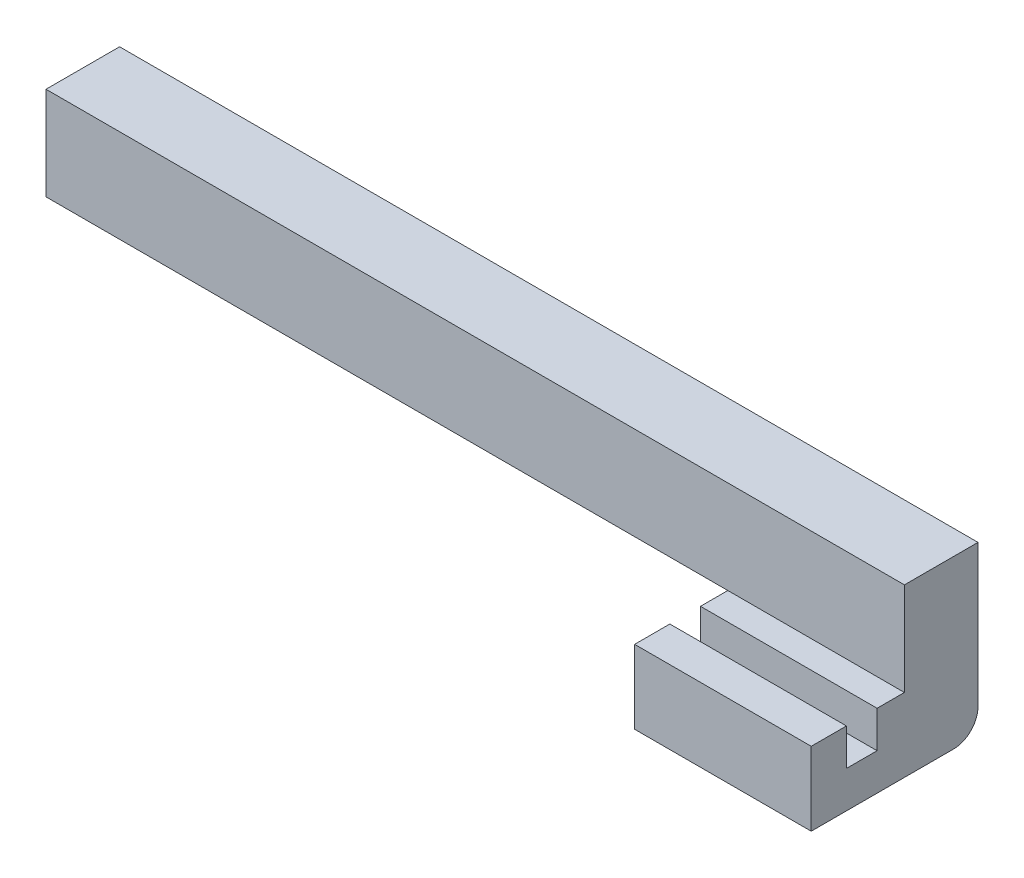
ISO-10303-21;
HEADER;
FILE_DESCRIPTION(('STEP AP214'),'2;1');
FILE_NAME('part.step','',(''),(''),'','','');
FILE_SCHEMA(('AUTOMOTIVE_DESIGN { 1 0 10303 214 1 1 1 1 }'));
ENDSEC;
DATA;
#1=APPLICATION_CONTEXT('core data for automotive mechanical design processes');
#2=APPLICATION_PROTOCOL_DEFINITION('international standard','automotive_design',2000,#1);
#3=PRODUCT_CONTEXT('',#1,'mechanical');
#4=PRODUCT('Part','Part','',(#3));
#5=PRODUCT_RELATED_PRODUCT_CATEGORY('part','',(#4));
#6=PRODUCT_DEFINITION_FORMATION('','',#4);
#7=PRODUCT_DEFINITION_CONTEXT('part definition',#1,'design');
#8=PRODUCT_DEFINITION('design','',#6,#7);
#9=PRODUCT_DEFINITION_SHAPE('','',#8);
#10=(LENGTH_UNIT() NAMED_UNIT(*) SI_UNIT(.MILLI.,.METRE.));
#11=(NAMED_UNIT(*) PLANE_ANGLE_UNIT() SI_UNIT($,.RADIAN.));
#12=(NAMED_UNIT(*) SI_UNIT($,.STERADIAN.) SOLID_ANGLE_UNIT());
#13=UNCERTAINTY_MEASURE_WITH_UNIT(LENGTH_MEASURE(1.E-05),#10,'distance_accuracy_value','');
#14=(GEOMETRIC_REPRESENTATION_CONTEXT(3) GLOBAL_UNCERTAINTY_ASSIGNED_CONTEXT((#13)) GLOBAL_UNIT_ASSIGNED_CONTEXT((#10,
#11,#12)) REPRESENTATION_CONTEXT('',''));
#15=CARTESIAN_POINT('',(0.,0.,0.));
#16=DIRECTION('',(0.,0.,1.));
#17=DIRECTION('',(1.,0.,0.));
#18=AXIS2_PLACEMENT_3D('',#15,#16,#17);
#19=CARTESIAN_POINT('',(0.,3.,0.));
#20=DIRECTION('',(0.,1.,0.));
#21=DIRECTION('',(0.,0.,1.));
#22=AXIS2_PLACEMENT_3D('',#19,#20,#21);
#23=PLANE('',#22);
#24=DIRECTION('',(-1.,0.,0.));
#25=VECTOR('',#24,1.);
#26=CARTESIAN_POINT('',(-1.6,3.,-0.785554579913609));
#27=LINE('',#26,#25);
#28=CARTESIAN_POINT('',(3.6,3.,-0.785554579913609));
#29=VERTEX_POINT('',#28);
#30=CARTESIAN_POINT('',(-3.6,3.,-0.785554579913609));
#31=VERTEX_POINT('',#30);
#32=EDGE_CURVE('E260',#29,#31,#27,.T.);
#33=ORIENTED_EDGE('',*,*,#32,.F.);
#34=DIRECTION('',(0.,0.,-1.));
#35=VECTOR('',#34,1.);
#36=CARTESIAN_POINT('',(3.6,3.,-1.9));
#37=LINE('',#36,#35);
#38=CARTESIAN_POINT('',(3.6,3.,-1.9));
#39=VERTEX_POINT('',#38);
#40=EDGE_CURVE('E299',#29,#39,#37,.T.);
#41=ORIENTED_EDGE('',*,*,#40,.T.);
#42=DIRECTION('',(-1.,0.,0.));
#43=VECTOR('',#42,1.);
#44=CARTESIAN_POINT('',(-3.6,3.,-1.9));
#45=LINE('',#44,#43);
#46=CARTESIAN_POINT('',(-3.6,3.,-1.9));
#47=VERTEX_POINT('',#46);
#48=EDGE_CURVE('E298',#39,#47,#45,.T.);
#49=ORIENTED_EDGE('',*,*,#48,.T.);
#50=DIRECTION('',(0.,0.,1.));
#51=VECTOR('',#50,1.);
#52=CARTESIAN_POINT('',(-3.6,3.,-1.9));
#53=LINE('',#52,#51);
#54=EDGE_CURVE('E178',#47,#31,#53,.T.);
#55=ORIENTED_EDGE('',*,*,#54,.T.);
#56=EDGE_LOOP('',(#33,#41,#49,#55));
#57=FACE_BOUND('',#56,.T.);
#58=ADVANCED_FACE('F45',(#57),#23,.T.);
#59=CARTESIAN_POINT('',(1.6,3.,-0.785554579913609));
#60=DIRECTION('',(-1.,0.,0.));
#61=DIRECTION('',(0.,0.,1.));
#62=AXIS2_PLACEMENT_3D('',#59,#60,#61);
#63=PLANE('',#62);
#64=DIRECTION('',(0.,-1.,0.));
#65=VECTOR('',#64,1.);
#66=CARTESIAN_POINT('',(1.6,3.,0.464445420086391));
#67=LINE('',#66,#65);
#68=CARTESIAN_POINT('',(1.6,1.5,0.464445420086391));
#69=VERTEX_POINT('',#68);
#70=CARTESIAN_POINT('',(1.6,0.,0.464445420086391));
#71=VERTEX_POINT('',#70);
#72=EDGE_CURVE('E267',#69,#71,#67,.T.);
#73=ORIENTED_EDGE('',*,*,#72,.F.);
#74=DIRECTION('',(0.,0.,-1.));
#75=VECTOR('',#74,1.);
#76=CARTESIAN_POINT('',(1.6,1.5,-0.785554579913609));
#77=LINE('',#76,#75);
#78=CARTESIAN_POINT('',(1.6,1.5,-0.785554579913609));
#79=VERTEX_POINT('',#78);
#80=EDGE_CURVE('E234',#69,#79,#77,.T.);
#81=ORIENTED_EDGE('',*,*,#80,.T.);
#82=DIRECTION('',(0.,-1.,0.));
#83=VECTOR('',#82,1.);
#84=CARTESIAN_POINT('',(1.6,3.,-0.785554579913609));
#85=LINE('',#84,#83);
#86=CARTESIAN_POINT('',(1.6,0.,-0.785554579913609));
#87=VERTEX_POINT('',#86);
#88=EDGE_CURVE('E290',#79,#87,#85,.T.);
#89=ORIENTED_EDGE('',*,*,#88,.T.);
#90=DIRECTION('',(0.,0.,-1.));
#91=VECTOR('',#90,1.);
#92=CARTESIAN_POINT('',(1.6,0.,-0.785554579913609));
#93=LINE('',#92,#91);
#94=EDGE_CURVE('E259',#71,#87,#93,.T.);
#95=ORIENTED_EDGE('',*,*,#94,.F.);
#96=EDGE_LOOP('',(#73,#81,#89,#95));
#97=FACE_BOUND('',#96,.T.);
#98=ADVANCED_FACE('F390',(#97),#63,.T.);
#99=CARTESIAN_POINT('',(-1.6,3.,-0.785554579913609));
#100=DIRECTION('',(1.,0.,0.));
#101=DIRECTION('',(0.,0.,-1.));
#102=AXIS2_PLACEMENT_3D('',#99,#100,#101);
#103=PLANE('',#102);
#104=DIRECTION('',(0.,-1.,0.));
#105=VECTOR('',#104,1.);
#106=CARTESIAN_POINT('',(-1.6,3.,-0.785554579913609));
#107=LINE('',#106,#105);
#108=CARTESIAN_POINT('',(-1.6,1.5,-0.785554579913609));
#109=VERTEX_POINT('',#108);
#110=CARTESIAN_POINT('',(-1.6,0.,-0.785554579913609));
#111=VERTEX_POINT('',#110);
#112=EDGE_CURVE('E287',#109,#111,#107,.T.);
#113=ORIENTED_EDGE('',*,*,#112,.F.);
#114=DIRECTION('',(0.,0.,1.));
#115=VECTOR('',#114,1.);
#116=CARTESIAN_POINT('',(-1.6,1.5,-0.785554579913609));
#117=LINE('',#116,#115);
#118=CARTESIAN_POINT('',(-1.6,1.5,0.464445420086391));
#119=VERTEX_POINT('',#118);
#120=EDGE_CURVE('E230',#109,#119,#117,.T.);
#121=ORIENTED_EDGE('',*,*,#120,.T.);
#122=DIRECTION('',(0.,-1.,0.));
#123=VECTOR('',#122,1.);
#124=CARTESIAN_POINT('',(-1.6,3.,0.464445420086391));
#125=LINE('',#124,#123);
#126=CARTESIAN_POINT('',(-1.6,0.,0.464445420086391));
#127=VERTEX_POINT('',#126);
#128=EDGE_CURVE('E284',#119,#127,#125,.T.);
#129=ORIENTED_EDGE('',*,*,#128,.T.);
#130=DIRECTION('',(0.,0.,1.));
#131=VECTOR('',#130,1.);
#132=CARTESIAN_POINT('',(-1.6,0.,-0.785554579913609));
#133=LINE('',#132,#131);
#134=EDGE_CURVE('E275',#111,#127,#133,.T.);
#135=ORIENTED_EDGE('',*,*,#134,.F.);
#136=EDGE_LOOP('',(#113,#121,#129,#135));
#137=FACE_BOUND('',#136,.T.);
#138=ADVANCED_FACE('F343',(#137),#103,.T.);
#139=DIRECTION('',(1.,0.,0.));
#140=VECTOR('',#139,1.);
#141=CARTESIAN_POINT('',(-1.6,3.,0.464445420086391));
#142=LINE('',#141,#140);
#143=CARTESIAN_POINT('',(-3.6,3.,0.464445420086391));
#144=VERTEX_POINT('',#143);
#145=CARTESIAN_POINT('',(3.6,3.,0.464445420086391));
#146=VERTEX_POINT('',#145);
#147=EDGE_CURVE('E263',#144,#146,#142,.T.);
#148=ORIENTED_EDGE('',*,*,#147,.F.);
#149=CARTESIAN_POINT('',(-3.6,3.,1.9));
#150=VERTEX_POINT('',#149);
#151=EDGE_CURVE('E302',#144,#150,#53,.T.);
#152=ORIENTED_EDGE('',*,*,#151,.T.);
#153=DIRECTION('',(1.,0.,0.));
#154=VECTOR('',#153,1.);
#155=CARTESIAN_POINT('',(-3.6,3.,1.9));
#156=LINE('',#155,#154);
#157=CARTESIAN_POINT('',(3.6,3.,1.9));
#158=VERTEX_POINT('',#157);
#159=EDGE_CURVE('E305',#150,#158,#156,.T.);
#160=ORIENTED_EDGE('',*,*,#159,.T.);
#161=EDGE_CURVE('E294',#158,#146,#37,.T.);
#162=ORIENTED_EDGE('',*,*,#161,.T.);
#163=EDGE_LOOP('',(#148,#152,#160,#162));
#164=FACE_BOUND('',#163,.T.);
#165=ADVANCED_FACE('F364',(#164),#23,.T.);
#166=CARTESIAN_POINT('',(0.,0.,0.));
#167=DIRECTION('',(0.,1.,0.));
#168=DIRECTION('',(0.,0.,1.));
#169=AXIS2_PLACEMENT_3D('',#166,#167,#168);
#170=PLANE('',#169);
#171=DIRECTION('',(0.,0.,1.));
#172=VECTOR('',#171,1.);
#173=CARTESIAN_POINT('',(-3.6,0.,-1.9));
#174=LINE('',#173,#172);
#175=CARTESIAN_POINT('',(-3.6,0.,-3.9));
#176=VERTEX_POINT('',#175);
#177=CARTESIAN_POINT('',(-3.6,0.,1.9));
#178=VERTEX_POINT('',#177);
#179=EDGE_CURVE('E311',#176,#178,#174,.T.);
#180=ORIENTED_EDGE('',*,*,#179,.F.);
#181=DIRECTION('',(-1.,0.,0.));
#182=VECTOR('',#181,1.);
#183=CARTESIAN_POINT('',(0.,0.,-3.9));
#184=LINE('',#183,#182);
#185=CARTESIAN_POINT('',(3.6,0.,-3.9));
#186=VERTEX_POINT('',#185);
#187=EDGE_CURVE('E54',#176,#186,#184,.F.);
#188=ORIENTED_EDGE('',*,*,#187,.T.);
#189=DIRECTION('',(0.,0.,-1.));
#190=VECTOR('',#189,1.);
#191=CARTESIAN_POINT('',(3.6,0.,-1.9));
#192=LINE('',#191,#190);
#193=CARTESIAN_POINT('',(3.6,0.,1.9));
#194=VERTEX_POINT('',#193);
#195=EDGE_CURVE('E293',#194,#186,#192,.T.);
#196=ORIENTED_EDGE('',*,*,#195,.F.);
#197=DIRECTION('',(1.,0.,0.));
#198=VECTOR('',#197,1.);
#199=CARTESIAN_POINT('',(-3.6,0.,1.9));
#200=LINE('',#199,#198);
#201=EDGE_CURVE('E314',#178,#194,#200,.T.);
#202=ORIENTED_EDGE('',*,*,#201,.F.);
#203=EDGE_LOOP('',(#180,#188,#196,#202));
#204=FACE_BOUND('',#203,.T.);
#205=ORIENTED_EDGE('',*,*,#94,.T.);
#206=DIRECTION('',(-1.,0.,0.));
#207=VECTOR('',#206,1.);
#208=CARTESIAN_POINT('',(-1.6,0.,-0.785554579913609));
#209=LINE('',#208,#207);
#210=EDGE_CURVE('E271',#87,#111,#209,.T.);
#211=ORIENTED_EDGE('',*,*,#210,.T.);
#212=ORIENTED_EDGE('',*,*,#134,.T.);
#213=DIRECTION('',(1.,0.,0.));
#214=VECTOR('',#213,1.);
#215=CARTESIAN_POINT('',(-1.6,0.,0.464445420086391));
#216=LINE('',#215,#214);
#217=EDGE_CURVE('E264',#127,#71,#216,.T.);
#218=ORIENTED_EDGE('',*,*,#217,.T.);
#219=EDGE_LOOP('',(#205,#211,#212,#218));
#220=FACE_BOUND('',#219,.T.);
#221=ADVANCED_FACE('F351',(#204,#220),#170,.F.);
#222=CARTESIAN_POINT('',(3.6,3.,-1.9));
#223=DIRECTION('',(-1.,0.,0.));
#224=DIRECTION('',(0.,0.,1.));
#225=AXIS2_PLACEMENT_3D('',#222,#223,#224);
#226=PLANE('',#225);
#227=ORIENTED_EDGE('',*,*,#195,.T.);
#228=CARTESIAN_POINT('',(3.6,1.,-3.9));
#229=DIRECTION('',(-1.,0.,0.));
#230=DIRECTION('',(0.,0.,1.));
#231=AXIS2_PLACEMENT_3D('',#228,#229,#230);
#232=CIRCLE('',#231,1.);
#233=CARTESIAN_POINT('',(3.6,1.,-4.9));
#234=VERTEX_POINT('',#233);
#235=EDGE_CURVE('E11',#186,#234,#232,.F.);
#236=ORIENTED_EDGE('',*,*,#235,.T.);
#237=DIRECTION('',(0.,-1.,0.));
#238=VECTOR('',#237,1.);
#239=CARTESIAN_POINT('',(3.6,0.,-4.9));
#240=LINE('',#239,#238);
#241=CARTESIAN_POINT('',(3.6,6.8,-4.9));
#242=VERTEX_POINT('',#241);
#243=EDGE_CURVE('E170',#242,#234,#240,.T.);
#244=ORIENTED_EDGE('',*,*,#243,.F.);
#245=DIRECTION('',(0.,0.,1.));
#246=VECTOR('',#245,1.);
#247=CARTESIAN_POINT('',(3.6,6.8,-4.9));
#248=LINE('',#247,#246);
#249=CARTESIAN_POINT('',(3.6,6.8,-1.9));
#250=VERTEX_POINT('',#249);
#251=EDGE_CURVE('E198',#242,#250,#248,.T.);
#252=ORIENTED_EDGE('',*,*,#251,.T.);
#253=DIRECTION('',(0.,-1.,0.));
#254=VECTOR('',#253,1.);
#255=CARTESIAN_POINT('',(3.6,0.,-1.9));
#256=LINE('',#255,#254);
#257=EDGE_CURVE('E199',#250,#39,#256,.T.);
#258=ORIENTED_EDGE('',*,*,#257,.T.);
#259=ORIENTED_EDGE('',*,*,#40,.F.);
#260=DIRECTION('',(0.,-1.,0.));
#261=VECTOR('',#260,1.);
#262=CARTESIAN_POINT('',(3.6,3.,-0.785554579913609));
#263=LINE('',#262,#261);
#264=CARTESIAN_POINT('',(3.6,1.5,-0.785554579913609));
#265=VERTEX_POINT('',#264);
#266=EDGE_CURVE('E255',#29,#265,#263,.T.);
#267=ORIENTED_EDGE('',*,*,#266,.T.);
#268=DIRECTION('',(0.,0.,-1.));
#269=VECTOR('',#268,1.);
#270=CARTESIAN_POINT('',(3.6,1.5,-1.9));
#271=LINE('',#270,#269);
#272=CARTESIAN_POINT('',(3.6,1.5,0.464445420086391));
#273=VERTEX_POINT('',#272);
#274=EDGE_CURVE('E241',#273,#265,#271,.T.);
#275=ORIENTED_EDGE('',*,*,#274,.F.);
#276=DIRECTION('',(0.,1.,0.));
#277=VECTOR('',#276,1.);
#278=CARTESIAN_POINT('',(3.6,3.,0.464445420086391));
#279=LINE('',#278,#277);
#280=EDGE_CURVE('E248',#273,#146,#279,.T.);
#281=ORIENTED_EDGE('',*,*,#280,.T.);
#282=ORIENTED_EDGE('',*,*,#161,.F.);
#283=DIRECTION('',(0.,-1.,0.));
#284=VECTOR('',#283,1.);
#285=CARTESIAN_POINT('',(3.6,3.,1.9));
#286=LINE('',#285,#284);
#287=EDGE_CURVE('E308',#158,#194,#286,.T.);
#288=ORIENTED_EDGE('',*,*,#287,.T.);
#289=EDGE_LOOP('',(#227,#236,#244,#252,#258,#259,#267,#275,#281,#282,#288));
#290=FACE_BOUND('',#289,.T.);
#291=ADVANCED_FACE('F363',(#290),#226,.F.);
#292=CARTESIAN_POINT('',(-3.6,3.,-1.9));
#293=DIRECTION('',(1.,0.,0.));
#294=DIRECTION('',(0.,0.,-1.));
#295=AXIS2_PLACEMENT_3D('',#292,#293,#294);
#296=PLANE('',#295);
#297=DIRECTION('',(0.,1.,0.));
#298=VECTOR('',#297,1.);
#299=CARTESIAN_POINT('',(-3.6,3.,-4.9));
#300=LINE('',#299,#298);
#301=CARTESIAN_POINT('',(-3.6,1.,-4.9));
#302=VERTEX_POINT('',#301);
#303=CARTESIAN_POINT('',(-3.6,3.,-4.9));
#304=VERTEX_POINT('',#303);
#305=EDGE_CURVE('E160',#302,#304,#300,.T.);
#306=ORIENTED_EDGE('',*,*,#305,.F.);
#307=CARTESIAN_POINT('',(-3.6,1.,-3.9));
#308=DIRECTION('',(1.,0.,0.));
#309=DIRECTION('',(0.,0.,-1.));
#310=AXIS2_PLACEMENT_3D('',#307,#308,#309);
#311=CIRCLE('',#310,1.);
#312=EDGE_CURVE('E68',#302,#176,#311,.F.);
#313=ORIENTED_EDGE('',*,*,#312,.T.);
#314=ORIENTED_EDGE('',*,*,#179,.T.);
#315=DIRECTION('',(0.,-1.,0.));
#316=VECTOR('',#315,1.);
#317=CARTESIAN_POINT('',(-3.6,3.,1.9));
#318=LINE('',#317,#316);
#319=EDGE_CURVE('E320',#150,#178,#318,.T.);
#320=ORIENTED_EDGE('',*,*,#319,.F.);
#321=ORIENTED_EDGE('',*,*,#151,.F.);
#322=DIRECTION('',(0.,-1.,0.));
#323=VECTOR('',#322,1.);
#324=CARTESIAN_POINT('',(-3.6,3.,0.464445420086391));
#325=LINE('',#324,#323);
#326=CARTESIAN_POINT('',(-3.6,1.5,0.464445420086391));
#327=VERTEX_POINT('',#326);
#328=EDGE_CURVE('E244',#144,#327,#325,.T.);
#329=ORIENTED_EDGE('',*,*,#328,.T.);
#330=DIRECTION('',(0.,0.,1.));
#331=VECTOR('',#330,1.);
#332=CARTESIAN_POINT('',(-3.6,1.5,-1.9));
#333=LINE('',#332,#331);
#334=CARTESIAN_POINT('',(-3.6,1.5,-0.785554579913609));
#335=VERTEX_POINT('',#334);
#336=EDGE_CURVE('E238',#335,#327,#333,.T.);
#337=ORIENTED_EDGE('',*,*,#336,.F.);
#338=DIRECTION('',(0.,1.,0.));
#339=VECTOR('',#338,1.);
#340=CARTESIAN_POINT('',(-3.6,3.,-0.785554579913609));
#341=LINE('',#340,#339);
#342=EDGE_CURVE('E252',#335,#31,#341,.T.);
#343=ORIENTED_EDGE('',*,*,#342,.T.);
#344=ORIENTED_EDGE('',*,*,#54,.F.);
#345=DIRECTION('',(0.,0.,1.));
#346=VECTOR('',#345,1.);
#347=CARTESIAN_POINT('',(-3.6,3.,-4.9));
#348=LINE('',#347,#346);
#349=EDGE_CURVE('E174',#304,#47,#348,.T.);
#350=ORIENTED_EDGE('',*,*,#349,.F.);
#351=EDGE_LOOP('',(#306,#313,#314,#320,#321,#329,#337,#343,#344,#350));
#352=FACE_BOUND('',#351,.T.);
#353=ADVANCED_FACE('F175',(#352),#296,.F.);
#354=CARTESIAN_POINT('',(-3.6,3.,1.9));
#355=DIRECTION('',(0.,0.,-1.));
#356=DIRECTION('',(-1.,0.,0.));
#357=AXIS2_PLACEMENT_3D('',#354,#355,#356);
#358=PLANE('',#357);
#359=ORIENTED_EDGE('',*,*,#201,.T.);
#360=ORIENTED_EDGE('',*,*,#287,.F.);
#361=ORIENTED_EDGE('',*,*,#159,.F.);
#362=ORIENTED_EDGE('',*,*,#319,.T.);
#363=EDGE_LOOP('',(#359,#360,#361,#362));
#364=FACE_BOUND('',#363,.T.);
#365=ADVANCED_FACE('F368',(#364),#358,.F.);
#366=CARTESIAN_POINT('',(-1.6,3.,-0.785554579913609));
#367=DIRECTION('',(0.,0.,1.));
#368=DIRECTION('',(1.,0.,0.));
#369=AXIS2_PLACEMENT_3D('',#366,#367,#368);
#370=PLANE('',#369);
#371=DIRECTION('',(-1.,0.,0.));
#372=VECTOR('',#371,1.);
#373=CARTESIAN_POINT('',(-5.5,1.5,-0.785554579913609));
#374=LINE('',#373,#372);
#375=EDGE_CURVE('E225',#109,#335,#374,.T.);
#376=ORIENTED_EDGE('',*,*,#375,.F.);
#377=ORIENTED_EDGE('',*,*,#112,.T.);
#378=ORIENTED_EDGE('',*,*,#210,.F.);
#379=ORIENTED_EDGE('',*,*,#88,.F.);
#380=EDGE_CURVE('E229',#265,#79,#374,.T.);
#381=ORIENTED_EDGE('',*,*,#380,.F.);
#382=ORIENTED_EDGE('',*,*,#266,.F.);
#383=ORIENTED_EDGE('',*,*,#32,.T.);
#384=ORIENTED_EDGE('',*,*,#342,.F.);
#385=EDGE_LOOP('',(#376,#377,#378,#379,#381,#382,#383,#384));
#386=FACE_BOUND('',#385,.T.);
#387=ADVANCED_FACE('F355',(#386),#370,.T.);
#388=CARTESIAN_POINT('',(-1.6,3.,0.464445420086391));
#389=DIRECTION('',(0.,0.,-1.));
#390=DIRECTION('',(-1.,0.,0.));
#391=AXIS2_PLACEMENT_3D('',#388,#389,#390);
#392=PLANE('',#391);
#393=ORIENTED_EDGE('',*,*,#147,.T.);
#394=ORIENTED_EDGE('',*,*,#280,.F.);
#395=DIRECTION('',(1.,0.,0.));
#396=VECTOR('',#395,1.);
#397=CARTESIAN_POINT('',(-5.5,1.5,0.464445420086391));
#398=LINE('',#397,#396);
#399=EDGE_CURVE('E182',#69,#273,#398,.T.);
#400=ORIENTED_EDGE('',*,*,#399,.F.);
#401=ORIENTED_EDGE('',*,*,#72,.T.);
#402=ORIENTED_EDGE('',*,*,#217,.F.);
#403=ORIENTED_EDGE('',*,*,#128,.F.);
#404=EDGE_CURVE('E224',#327,#119,#398,.T.);
#405=ORIENTED_EDGE('',*,*,#404,.F.);
#406=ORIENTED_EDGE('',*,*,#328,.F.);
#407=EDGE_LOOP('',(#393,#394,#400,#401,#402,#403,#405,#406));
#408=FACE_BOUND('',#407,.T.);
#409=ADVANCED_FACE('F346',(#408),#392,.T.);
#410=CARTESIAN_POINT('',(0.,1.5,0.));
#411=DIRECTION('',(0.,1.,0.));
#412=DIRECTION('',(0.,0.,1.));
#413=AXIS2_PLACEMENT_3D('',#410,#411,#412);
#414=PLANE('',#413);
#415=ORIENTED_EDGE('',*,*,#336,.T.);
#416=ORIENTED_EDGE('',*,*,#404,.T.);
#417=ORIENTED_EDGE('',*,*,#120,.F.);
#418=ORIENTED_EDGE('',*,*,#375,.T.);
#419=EDGE_LOOP('',(#415,#416,#417,#418));
#420=FACE_BOUND('',#419,.T.);
#421=ADVANCED_FACE('F335',(#420),#414,.T.);
#422=ORIENTED_EDGE('',*,*,#274,.T.);
#423=ORIENTED_EDGE('',*,*,#380,.T.);
#424=ORIENTED_EDGE('',*,*,#80,.F.);
#425=ORIENTED_EDGE('',*,*,#399,.T.);
#426=EDGE_LOOP('',(#422,#423,#424,#425));
#427=FACE_BOUND('',#426,.T.);
#428=ADVANCED_FACE('F388',(#427),#414,.T.);
#429=CARTESIAN_POINT('',(0.,0.,-1.9));
#430=DIRECTION('',(0.,0.,1.));
#431=DIRECTION('',(1.,0.,0.));
#432=AXIS2_PLACEMENT_3D('',#429,#430,#431);
#433=PLANE('',#432);
#434=ORIENTED_EDGE('',*,*,#48,.F.);
#435=ORIENTED_EDGE('',*,*,#257,.F.);
#436=DIRECTION('',(1.,0.,0.));
#437=VECTOR('',#436,1.);
#438=CARTESIAN_POINT('',(3.6,6.8,-1.9));
#439=LINE('',#438,#437);
#440=CARTESIAN_POINT('',(-31.4,6.8,-1.9));
#441=VERTEX_POINT('',#440);
#442=EDGE_CURVE('E209',#441,#250,#439,.T.);
#443=ORIENTED_EDGE('',*,*,#442,.F.);
#444=DIRECTION('',(0.,1.,0.));
#445=VECTOR('',#444,1.);
#446=CARTESIAN_POINT('',(-31.4,3.,-1.9));
#447=LINE('',#446,#445);
#448=CARTESIAN_POINT('',(-31.4,3.,-1.9));
#449=VERTEX_POINT('',#448);
#450=EDGE_CURVE('E206',#449,#441,#447,.T.);
#451=ORIENTED_EDGE('',*,*,#450,.F.);
#452=DIRECTION('',(-1.,0.,0.));
#453=VECTOR('',#452,1.);
#454=CARTESIAN_POINT('',(-3.6,3.,-1.9));
#455=LINE('',#454,#453);
#456=EDGE_CURVE('E203',#47,#449,#455,.T.);
#457=ORIENTED_EDGE('',*,*,#456,.F.);
#458=EDGE_LOOP('',(#434,#435,#443,#451,#457));
#459=FACE_BOUND('',#458,.T.);
#460=ADVANCED_FACE('F383',(#459),#433,.T.);
#461=CARTESIAN_POINT('',(-3.6,3.,-4.9));
#462=DIRECTION('',(0.,1.,0.));
#463=DIRECTION('',(0.,0.,1.));
#464=AXIS2_PLACEMENT_3D('',#461,#462,#463);
#465=PLANE('',#464);
#466=ORIENTED_EDGE('',*,*,#456,.T.);
#467=DIRECTION('',(0.,0.,1.));
#468=VECTOR('',#467,1.);
#469=CARTESIAN_POINT('',(-31.4,3.,-4.9));
#470=LINE('',#469,#468);
#471=CARTESIAN_POINT('',(-31.4,3.,-4.9));
#472=VERTEX_POINT('',#471);
#473=EDGE_CURVE('E183',#472,#449,#470,.T.);
#474=ORIENTED_EDGE('',*,*,#473,.F.);
#475=DIRECTION('',(-1.,0.,0.));
#476=VECTOR('',#475,1.);
#477=CARTESIAN_POINT('',(-3.6,3.,-4.9));
#478=LINE('',#477,#476);
#479=EDGE_CURVE('E165',#304,#472,#478,.T.);
#480=ORIENTED_EDGE('',*,*,#479,.F.);
#481=ORIENTED_EDGE('',*,*,#349,.T.);
#482=EDGE_LOOP('',(#466,#474,#480,#481));
#483=FACE_BOUND('',#482,.T.);
#484=ADVANCED_FACE('F185',(#483),#465,.F.);
#485=CARTESIAN_POINT('',(-31.4,3.,-4.9));
#486=DIRECTION('',(1.,0.,0.));
#487=DIRECTION('',(0.,0.,-1.));
#488=AXIS2_PLACEMENT_3D('',#485,#486,#487);
#489=PLANE('',#488);
#490=ORIENTED_EDGE('',*,*,#450,.T.);
#491=DIRECTION('',(0.,0.,1.));
#492=VECTOR('',#491,1.);
#493=CARTESIAN_POINT('',(-31.4,6.8,-4.9));
#494=LINE('',#493,#492);
#495=CARTESIAN_POINT('',(-31.4,6.8,-4.9));
#496=VERTEX_POINT('',#495);
#497=EDGE_CURVE('E215',#496,#441,#494,.T.);
#498=ORIENTED_EDGE('',*,*,#497,.F.);
#499=DIRECTION('',(0.,1.,0.));
#500=VECTOR('',#499,1.);
#501=CARTESIAN_POINT('',(-31.4,3.,-4.9));
#502=LINE('',#501,#500);
#503=EDGE_CURVE('E189',#472,#496,#502,.T.);
#504=ORIENTED_EDGE('',*,*,#503,.F.);
#505=ORIENTED_EDGE('',*,*,#473,.T.);
#506=EDGE_LOOP('',(#490,#498,#504,#505));
#507=FACE_BOUND('',#506,.T.);
#508=ADVANCED_FACE('F441',(#507),#489,.F.);
#509=CARTESIAN_POINT('',(3.6,6.8,-4.9));
#510=DIRECTION('',(0.,-1.,0.));
#511=DIRECTION('',(0.,0.,-1.));
#512=AXIS2_PLACEMENT_3D('',#509,#510,#511);
#513=PLANE('',#512);
#514=ORIENTED_EDGE('',*,*,#442,.T.);
#515=ORIENTED_EDGE('',*,*,#251,.F.);
#516=DIRECTION('',(1.,0.,0.));
#517=VECTOR('',#516,1.);
#518=CARTESIAN_POINT('',(3.6,6.8,-4.9));
#519=LINE('',#518,#517);
#520=EDGE_CURVE('E192',#496,#242,#519,.T.);
#521=ORIENTED_EDGE('',*,*,#520,.F.);
#522=ORIENTED_EDGE('',*,*,#497,.T.);
#523=EDGE_LOOP('',(#514,#515,#521,#522));
#524=FACE_BOUND('',#523,.T.);
#525=ADVANCED_FACE('F378',(#524),#513,.F.);
#526=CARTESIAN_POINT('',(0.,0.,-4.9));
#527=DIRECTION('',(0.,0.,1.));
#528=DIRECTION('',(1.,0.,0.));
#529=AXIS2_PLACEMENT_3D('',#526,#527,#528);
#530=PLANE('',#529);
#531=ORIENTED_EDGE('',*,*,#243,.T.);
#532=DIRECTION('',(-1.,0.,0.));
#533=VECTOR('',#532,1.);
#534=CARTESIAN_POINT('',(0.,1.,-4.9));
#535=LINE('',#534,#533);
#536=EDGE_CURVE('E168',#234,#302,#535,.T.);
#537=ORIENTED_EDGE('',*,*,#536,.T.);
#538=ORIENTED_EDGE('',*,*,#305,.T.);
#539=ORIENTED_EDGE('',*,*,#479,.T.);
#540=ORIENTED_EDGE('',*,*,#503,.T.);
#541=ORIENTED_EDGE('',*,*,#520,.T.);
#542=EDGE_LOOP('',(#531,#537,#538,#539,#540,#541));
#543=FACE_BOUND('',#542,.T.);
#544=ADVANCED_FACE('F163',(#543),#530,.F.);
#545=CARTESIAN_POINT('',(0.,1.,-3.9));
#546=DIRECTION('',(-1.,0.,0.));
#547=DIRECTION('',(0.,0.,1.));
#548=AXIS2_PLACEMENT_3D('',#545,#546,#547);
#549=CYLINDRICAL_SURFACE('',#548,1.);
#550=ORIENTED_EDGE('',*,*,#235,.F.);
#551=ORIENTED_EDGE('',*,*,#187,.F.);
#552=ORIENTED_EDGE('',*,*,#312,.F.);
#553=ORIENTED_EDGE('',*,*,#536,.F.);
#554=EDGE_LOOP('',(#550,#551,#552,#553));
#555=FACE_BOUND('',#554,.T.);
#556=ADVANCED_FACE('F47',(#555),#549,.T.);
#557=CLOSED_SHELL('',(#58,#98,#138,#165,#221,#291,#353,#365,#387,#409,#421,#428,#460,#484,#508,
#525,#544,#556));
#558=MANIFOLD_SOLID_BREP('B2',#557);
#559=ADVANCED_BREP_SHAPE_REPRESENTATION('',(#18,#558),#14);
#560=SHAPE_DEFINITION_REPRESENTATION(#9,#559);
ENDSEC;
END-ISO-10303-21;
